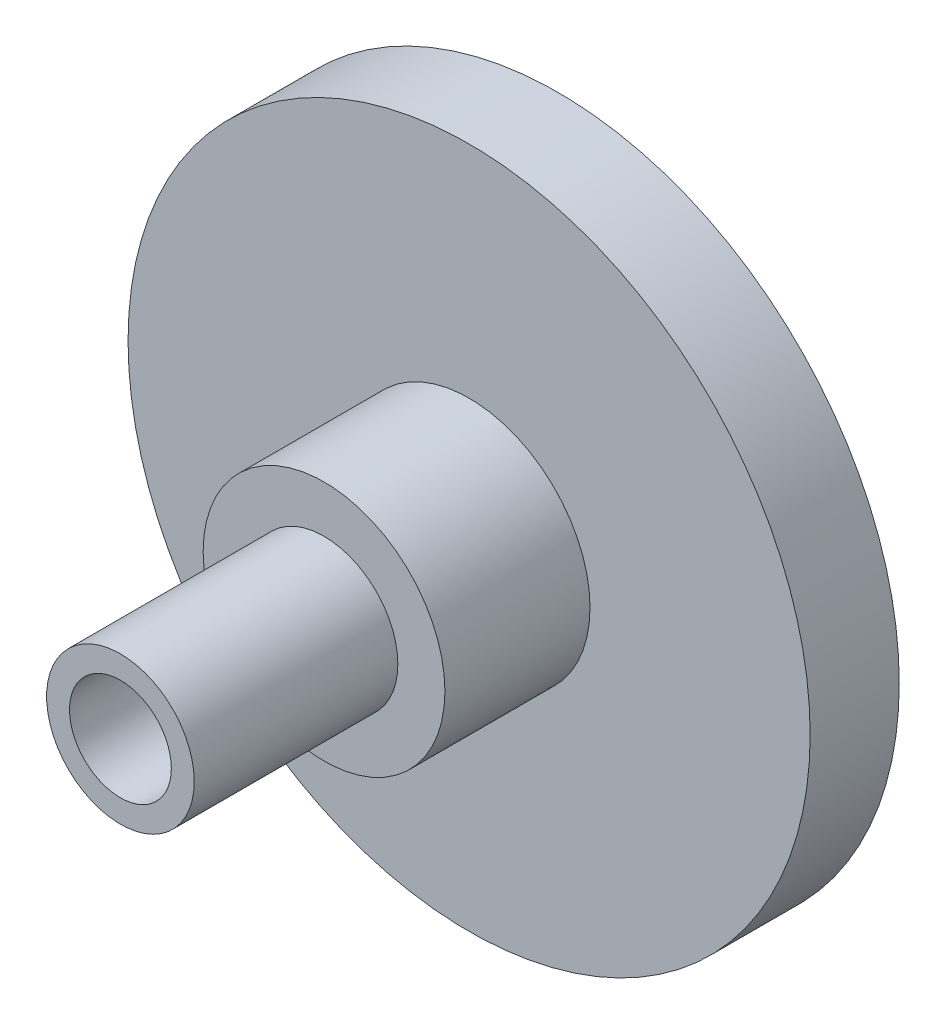
ISO-10303-21;
HEADER;
FILE_DESCRIPTION(('STEP AP214'),'2;1');
FILE_NAME('part.step','',(''),(''),'','','');
FILE_SCHEMA(('AUTOMOTIVE_DESIGN { 1 0 10303 214 1 1 1 1 }'));
ENDSEC;
DATA;
#1=APPLICATION_CONTEXT('core data for automotive mechanical design processes');
#2=APPLICATION_PROTOCOL_DEFINITION('international standard','automotive_design',2000,#1);
#3=PRODUCT_CONTEXT('',#1,'mechanical');
#4=PRODUCT('Part','Part','',(#3));
#5=PRODUCT_RELATED_PRODUCT_CATEGORY('part','',(#4));
#6=PRODUCT_DEFINITION_FORMATION('','',#4);
#7=PRODUCT_DEFINITION_CONTEXT('part definition',#1,'design');
#8=PRODUCT_DEFINITION('design','',#6,#7);
#9=PRODUCT_DEFINITION_SHAPE('','',#8);
#10=(LENGTH_UNIT() NAMED_UNIT(*) SI_UNIT(.MILLI.,.METRE.));
#11=(NAMED_UNIT(*) PLANE_ANGLE_UNIT() SI_UNIT($,.RADIAN.));
#12=(NAMED_UNIT(*) SI_UNIT($,.STERADIAN.) SOLID_ANGLE_UNIT());
#13=UNCERTAINTY_MEASURE_WITH_UNIT(LENGTH_MEASURE(1.E-05),#10,'distance_accuracy_value','');
#14=(GEOMETRIC_REPRESENTATION_CONTEXT(3) GLOBAL_UNCERTAINTY_ASSIGNED_CONTEXT((#13)) GLOBAL_UNIT_ASSIGNED_CONTEXT((#10,
#11,#12)) REPRESENTATION_CONTEXT('',''));
#15=CARTESIAN_POINT('',(0.,0.,0.));
#16=DIRECTION('',(0.,0.,1.));
#17=DIRECTION('',(1.,0.,0.));
#18=AXIS2_PLACEMENT_3D('',#15,#16,#17);
#19=CARTESIAN_POINT('',(0.,0.,4.6));
#20=DIRECTION('',(0.,0.,1.));
#21=DIRECTION('',(1.,0.,0.));
#22=AXIS2_PLACEMENT_3D('',#19,#20,#21);
#23=PLANE('',#22);
#24=CARTESIAN_POINT('',(0.,0.,4.6));
#25=DIRECTION('',(0.,0.,1.));
#26=DIRECTION('',(1.,0.,0.));
#27=AXIS2_PLACEMENT_3D('',#24,#25,#26);
#28=CIRCLE('',#27,2.375);
#29=CARTESIAN_POINT('',(2.375,0.,4.6));
#30=VERTEX_POINT('',#29);
#31=EDGE_CURVE('E50',#30,#30,#28,.T.);
#32=ORIENTED_EDGE('',*,*,#31,.T.);
#33=EDGE_LOOP('',(#32));
#34=FACE_BOUND('',#33,.T.);
#35=CARTESIAN_POINT('',(0.,0.,4.6));
#36=DIRECTION('',(0.,0.,1.));
#37=DIRECTION('',(1.,0.,0.));
#38=AXIS2_PLACEMENT_3D('',#35,#36,#37);
#39=CIRCLE('',#38,1.45);
#40=CARTESIAN_POINT('',(1.45,0.,4.6));
#41=VERTEX_POINT('',#40);
#42=EDGE_CURVE('E57',#41,#41,#39,.T.);
#43=ORIENTED_EDGE('',*,*,#42,.F.);
#44=EDGE_LOOP('',(#43));
#45=FACE_BOUND('',#44,.T.);
#46=ADVANCED_FACE('F35',(#34,#45),#23,.T.);
#47=CARTESIAN_POINT('',(0.,0.,1.75));
#48=DIRECTION('',(0.,0.,1.));
#49=DIRECTION('',(1.,0.,0.));
#50=AXIS2_PLACEMENT_3D('',#47,#48,#49);
#51=PLANE('',#50);
#52=CARTESIAN_POINT('',(0.,0.,1.75));
#53=DIRECTION('',(0.,0.,1.));
#54=DIRECTION('',(1.,0.,0.));
#55=AXIS2_PLACEMENT_3D('',#52,#53,#54);
#56=CIRCLE('',#55,6.7);
#57=CARTESIAN_POINT('',(6.7,0.,1.75));
#58=VERTEX_POINT('',#57);
#59=EDGE_CURVE('E10',#58,#58,#56,.T.);
#60=ORIENTED_EDGE('',*,*,#59,.T.);
#61=EDGE_LOOP('',(#60));
#62=FACE_BOUND('',#61,.T.);
#63=CARTESIAN_POINT('',(0.,0.,1.75));
#64=DIRECTION('',(0.,0.,1.));
#65=DIRECTION('',(1.,0.,0.));
#66=AXIS2_PLACEMENT_3D('',#63,#64,#65);
#67=CIRCLE('',#66,2.375);
#68=CARTESIAN_POINT('',(2.375,0.,1.75));
#69=VERTEX_POINT('',#68);
#70=EDGE_CURVE('E51',#69,#69,#67,.T.);
#71=ORIENTED_EDGE('',*,*,#70,.F.);
#72=EDGE_LOOP('',(#71));
#73=FACE_BOUND('',#72,.T.);
#74=ADVANCED_FACE('F83',(#62,#73),#51,.T.);
#75=CARTESIAN_POINT('',(0.,0.,0.));
#76=DIRECTION('',(0.,0.,1.));
#77=DIRECTION('',(1.,0.,0.));
#78=AXIS2_PLACEMENT_3D('',#75,#76,#77);
#79=PLANE('',#78);
#80=CARTESIAN_POINT('',(0.,0.,0.));
#81=DIRECTION('',(0.,0.,1.));
#82=DIRECTION('',(1.,0.,0.));
#83=AXIS2_PLACEMENT_3D('',#80,#81,#82);
#84=CIRCLE('',#83,6.7);
#85=CARTESIAN_POINT('',(6.7,0.,0.));
#86=VERTEX_POINT('',#85);
#87=EDGE_CURVE('E39',#86,#86,#84,.T.);
#88=ORIENTED_EDGE('',*,*,#87,.F.);
#89=EDGE_LOOP('',(#88));
#90=FACE_BOUND('',#89,.T.);
#91=CARTESIAN_POINT('',(0.,0.,0.));
#92=DIRECTION('',(0.,0.,1.));
#93=DIRECTION('',(1.,0.,0.));
#94=AXIS2_PLACEMENT_3D('',#91,#92,#93);
#95=CIRCLE('',#94,1.);
#96=CARTESIAN_POINT('',(1.,0.,0.));
#97=VERTEX_POINT('',#96);
#98=EDGE_CURVE('E46',#97,#97,#95,.T.);
#99=ORIENTED_EDGE('',*,*,#98,.T.);
#100=EDGE_LOOP('',(#99));
#101=FACE_BOUND('',#100,.T.);
#102=ADVANCED_FACE('F89',(#90,#101),#79,.F.);
#103=CARTESIAN_POINT('',(0.,0.,1.75));
#104=DIRECTION('',(0.,0.,-1.));
#105=DIRECTION('',(-1.,0.,0.));
#106=AXIS2_PLACEMENT_3D('',#103,#104,#105);
#107=CYLINDRICAL_SURFACE('',#106,6.7);
#108=ORIENTED_EDGE('',*,*,#59,.F.);
#109=EDGE_LOOP('',(#108));
#110=FACE_BOUND('',#109,.T.);
#111=ORIENTED_EDGE('',*,*,#87,.T.);
#112=EDGE_LOOP('',(#111));
#113=FACE_BOUND('',#112,.T.);
#114=ADVANCED_FACE('F37',(#110,#113),#107,.T.);
#115=CARTESIAN_POINT('',(0.,0.,1.75));
#116=DIRECTION('',(0.,0.,-1.));
#117=DIRECTION('',(-1.,0.,0.));
#118=AXIS2_PLACEMENT_3D('',#115,#116,#117);
#119=CYLINDRICAL_SURFACE('',#118,1.);
#120=ORIENTED_EDGE('',*,*,#98,.F.);
#121=EDGE_LOOP('',(#120));
#122=FACE_BOUND('',#121,.T.);
#123=CARTESIAN_POINT('',(0.,0.,8.6));
#124=DIRECTION('',(0.,0.,1.));
#125=DIRECTION('',(1.,0.,0.));
#126=AXIS2_PLACEMENT_3D('',#123,#124,#125);
#127=CIRCLE('',#126,1.);
#128=CARTESIAN_POINT('',(1.,0.,8.6));
#129=VERTEX_POINT('',#128);
#130=EDGE_CURVE('E60',#129,#129,#127,.T.);
#131=ORIENTED_EDGE('',*,*,#130,.T.);
#132=EDGE_LOOP('',(#131));
#133=FACE_BOUND('',#132,.T.);
#134=ADVANCED_FACE('F66',(#122,#133),#119,.F.);
#135=CARTESIAN_POINT('',(0.,0.,4.6));
#136=DIRECTION('',(0.,0.,-1.));
#137=DIRECTION('',(-1.,0.,0.));
#138=AXIS2_PLACEMENT_3D('',#135,#136,#137);
#139=CYLINDRICAL_SURFACE('',#138,2.375);
#140=ORIENTED_EDGE('',*,*,#31,.F.);
#141=EDGE_LOOP('',(#140));
#142=FACE_BOUND('',#141,.T.);
#143=ORIENTED_EDGE('',*,*,#70,.T.);
#144=EDGE_LOOP('',(#143));
#145=FACE_BOUND('',#144,.T.);
#146=ADVANCED_FACE('F71',(#142,#145),#139,.T.);
#147=CARTESIAN_POINT('',(0.,0.,8.6));
#148=DIRECTION('',(0.,0.,1.));
#149=DIRECTION('',(1.,0.,0.));
#150=AXIS2_PLACEMENT_3D('',#147,#148,#149);
#151=PLANE('',#150);
#152=CARTESIAN_POINT('',(0.,0.,8.6));
#153=DIRECTION('',(0.,0.,1.));
#154=DIRECTION('',(1.,0.,0.));
#155=AXIS2_PLACEMENT_3D('',#152,#153,#154);
#156=CIRCLE('',#155,1.45);
#157=CARTESIAN_POINT('',(1.45,0.,8.6));
#158=VERTEX_POINT('',#157);
#159=EDGE_CURVE('E54',#158,#158,#156,.T.);
#160=ORIENTED_EDGE('',*,*,#159,.T.);
#161=EDGE_LOOP('',(#160));
#162=FACE_BOUND('',#161,.T.);
#163=ORIENTED_EDGE('',*,*,#130,.F.);
#164=EDGE_LOOP('',(#163));
#165=FACE_BOUND('',#164,.T.);
#166=ADVANCED_FACE('F68',(#162,#165),#151,.T.);
#167=CARTESIAN_POINT('',(0.,0.,8.6));
#168=DIRECTION('',(0.,0.,-1.));
#169=DIRECTION('',(-1.,0.,0.));
#170=AXIS2_PLACEMENT_3D('',#167,#168,#169);
#171=CYLINDRICAL_SURFACE('',#170,1.45);
#172=ORIENTED_EDGE('',*,*,#159,.F.);
#173=EDGE_LOOP('',(#172));
#174=FACE_BOUND('',#173,.T.);
#175=ORIENTED_EDGE('',*,*,#42,.T.);
#176=EDGE_LOOP('',(#175));
#177=FACE_BOUND('',#176,.T.);
#178=ADVANCED_FACE('F70',(#174,#177),#171,.T.);
#179=CLOSED_SHELL('',(#46,#74,#102,#114,#134,#146,#166,#178));
#180=MANIFOLD_SOLID_BREP('B2',#179);
#181=ADVANCED_BREP_SHAPE_REPRESENTATION('',(#18,#180),#14);
#182=SHAPE_DEFINITION_REPRESENTATION(#9,#181);
ENDSEC;
END-ISO-10303-21;
